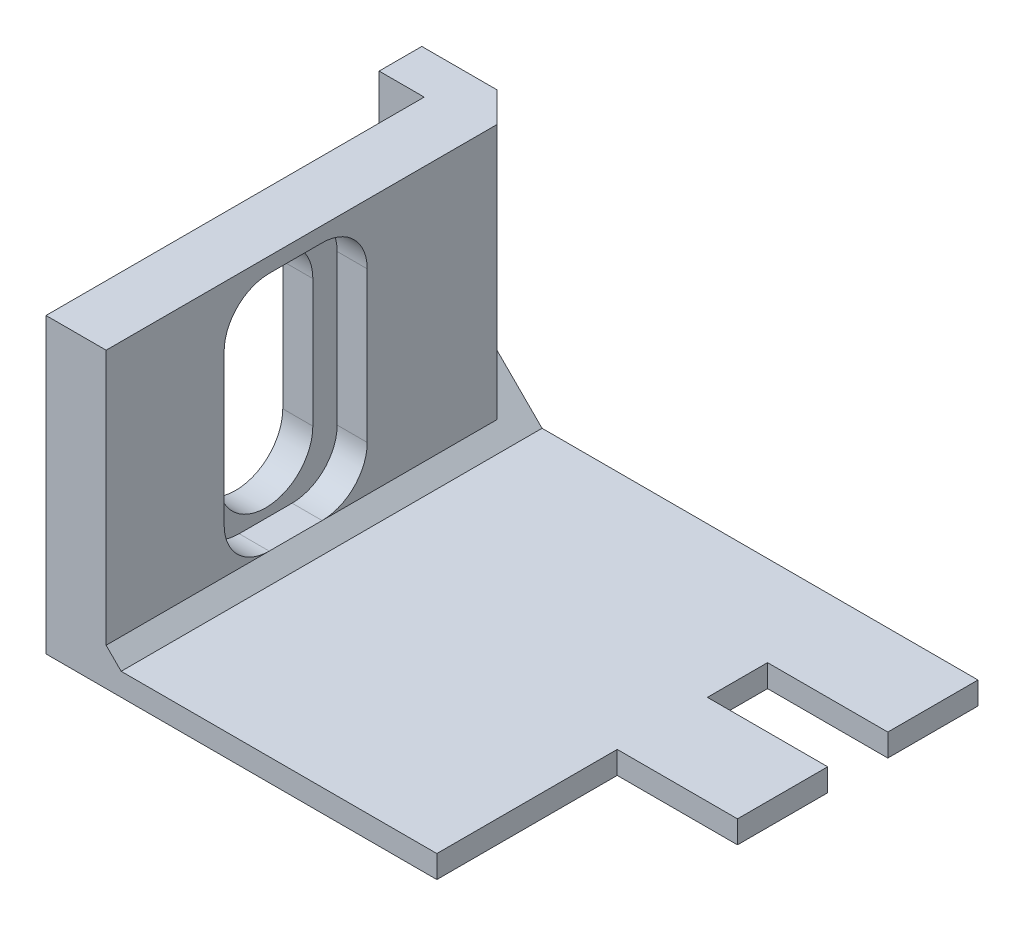
ISO-10303-21;
HEADER;
FILE_DESCRIPTION(('STEP AP214'),'2;1');
FILE_NAME('part.step','',(''),(''),'','','');
FILE_SCHEMA(('AUTOMOTIVE_DESIGN { 1 0 10303 214 1 1 1 1 }'));
ENDSEC;
DATA;
#1=APPLICATION_CONTEXT('core data for automotive mechanical design processes');
#2=APPLICATION_PROTOCOL_DEFINITION('international standard','automotive_design',2000,#1);
#3=PRODUCT_CONTEXT('',#1,'mechanical');
#4=PRODUCT('Part','Part','',(#3));
#5=PRODUCT_RELATED_PRODUCT_CATEGORY('part','',(#4));
#6=PRODUCT_DEFINITION_FORMATION('','',#4);
#7=PRODUCT_DEFINITION_CONTEXT('part definition',#1,'design');
#8=PRODUCT_DEFINITION('design','',#6,#7);
#9=PRODUCT_DEFINITION_SHAPE('','',#8);
#10=(LENGTH_UNIT() NAMED_UNIT(*) SI_UNIT(.MILLI.,.METRE.));
#11=(NAMED_UNIT(*) PLANE_ANGLE_UNIT() SI_UNIT($,.RADIAN.));
#12=(NAMED_UNIT(*) SI_UNIT($,.STERADIAN.) SOLID_ANGLE_UNIT());
#13=UNCERTAINTY_MEASURE_WITH_UNIT(LENGTH_MEASURE(1.E-05),#10,'distance_accuracy_value','');
#14=(GEOMETRIC_REPRESENTATION_CONTEXT(3) GLOBAL_UNCERTAINTY_ASSIGNED_CONTEXT((#13)) GLOBAL_UNIT_ASSIGNED_CONTEXT((#10,
#11,#12)) REPRESENTATION_CONTEXT('',''));
#15=CARTESIAN_POINT('',(0.,0.,0.));
#16=DIRECTION('',(0.,0.,1.));
#17=DIRECTION('',(1.,0.,0.));
#18=AXIS2_PLACEMENT_3D('',#15,#16,#17);
#19=CARTESIAN_POINT('',(0.,1.5,0.));
#20=DIRECTION('',(0.,-1.,0.));
#21=DIRECTION('',(0.,0.,-1.));
#22=AXIS2_PLACEMENT_3D('',#19,#20,#21);
#23=PLANE('',#22);
#24=DIRECTION('',(-1.,0.,0.));
#25=VECTOR('',#24,1.);
#26=CARTESIAN_POINT('',(0.,1.5,0.));
#27=LINE('',#26,#25);
#28=CARTESIAN_POINT('',(37.,1.5,0.));
#29=VERTEX_POINT('',#28);
#30=CARTESIAN_POINT('',(7.99999999999999,1.5,0.));
#31=VERTEX_POINT('',#30);
#32=EDGE_CURVE('E338',#29,#31,#27,.T.);
#33=ORIENTED_EDGE('',*,*,#32,.T.);
#34=DIRECTION('',(0.,0.,1.));
#35=VECTOR('',#34,1.);
#36=CARTESIAN_POINT('',(8.,1.5,28.));
#37=LINE('',#36,#35);
#38=CARTESIAN_POINT('',(8.,1.5,28.));
#39=VERTEX_POINT('',#38);
#40=EDGE_CURVE('E431',#31,#39,#37,.T.);
#41=ORIENTED_EDGE('',*,*,#40,.T.);
#42=DIRECTION('',(1.,0.,0.));
#43=VECTOR('',#42,1.);
#44=CARTESIAN_POINT('',(3.,1.5,28.));
#45=LINE('',#44,#43);
#46=CARTESIAN_POINT('',(29.,1.5,28.));
#47=VERTEX_POINT('',#46);
#48=EDGE_CURVE('E341',#39,#47,#45,.T.);
#49=ORIENTED_EDGE('',*,*,#48,.T.);
#50=DIRECTION('',(0.,0.,-1.));
#51=VECTOR('',#50,1.);
#52=CARTESIAN_POINT('',(29.,1.5,16.));
#53=LINE('',#52,#51);
#54=CARTESIAN_POINT('',(29.,1.5,16.));
#55=VERTEX_POINT('',#54);
#56=EDGE_CURVE('E344',#47,#55,#53,.T.);
#57=ORIENTED_EDGE('',*,*,#56,.T.);
#58=DIRECTION('',(1.,0.,0.));
#59=VECTOR('',#58,1.);
#60=CARTESIAN_POINT('',(29.,1.5,16.));
#61=LINE('',#60,#59);
#62=CARTESIAN_POINT('',(37.,1.5,16.));
#63=VERTEX_POINT('',#62);
#64=EDGE_CURVE('E346',#55,#63,#61,.T.);
#65=ORIENTED_EDGE('',*,*,#64,.T.);
#66=DIRECTION('',(0.,0.,-1.));
#67=VECTOR('',#66,1.);
#68=CARTESIAN_POINT('',(37.,1.5,10.));
#69=LINE('',#68,#67);
#70=CARTESIAN_POINT('',(37.,1.5,10.));
#71=VERTEX_POINT('',#70);
#72=EDGE_CURVE('E348',#63,#71,#69,.T.);
#73=ORIENTED_EDGE('',*,*,#72,.T.);
#74=DIRECTION('',(-1.,0.,0.));
#75=VECTOR('',#74,1.);
#76=CARTESIAN_POINT('',(29.,1.5,10.));
#77=LINE('',#76,#75);
#78=CARTESIAN_POINT('',(29.,1.5,10.));
#79=VERTEX_POINT('',#78);
#80=EDGE_CURVE('E350',#71,#79,#77,.T.);
#81=ORIENTED_EDGE('',*,*,#80,.T.);
#82=DIRECTION('',(0.,0.,-1.));
#83=VECTOR('',#82,1.);
#84=CARTESIAN_POINT('',(29.,1.5,6.));
#85=LINE('',#84,#83);
#86=CARTESIAN_POINT('',(29.,1.5,6.));
#87=VERTEX_POINT('',#86);
#88=EDGE_CURVE('E352',#79,#87,#85,.T.);
#89=ORIENTED_EDGE('',*,*,#88,.T.);
#90=DIRECTION('',(1.,0.,0.));
#91=VECTOR('',#90,1.);
#92=CARTESIAN_POINT('',(29.,1.5,6.));
#93=LINE('',#92,#91);
#94=CARTESIAN_POINT('',(37.,1.5,6.));
#95=VERTEX_POINT('',#94);
#96=EDGE_CURVE('E354',#87,#95,#93,.T.);
#97=ORIENTED_EDGE('',*,*,#96,.T.);
#98=DIRECTION('',(0.,0.,-1.));
#99=VECTOR('',#98,1.);
#100=CARTESIAN_POINT('',(37.,1.5,0.));
#101=LINE('',#100,#99);
#102=EDGE_CURVE('E356',#95,#29,#101,.T.);
#103=ORIENTED_EDGE('',*,*,#102,.T.);
#104=EDGE_LOOP('',(#33,#41,#49,#57,#65,#73,#81,#89,#97,#103));
#105=FACE_BOUND('',#104,.T.);
#106=ADVANCED_FACE('F35',(#105),#23,.F.);
#107=CARTESIAN_POINT('',(0.,1.5,0.));
#108=DIRECTION('',(0.,0.,1.));
#109=DIRECTION('',(1.,0.,0.));
#110=AXIS2_PLACEMENT_3D('',#107,#108,#109);
#111=PLANE('',#110);
#112=DIRECTION('',(-1.,0.,0.));
#113=VECTOR('',#112,1.);
#114=CARTESIAN_POINT('',(0.,19.5,0.));
#115=LINE('',#114,#113);
#116=CARTESIAN_POINT('',(5.,19.5,0.));
#117=VERTEX_POINT('',#116);
#118=CARTESIAN_POINT('',(0.,19.5,0.));
#119=VERTEX_POINT('',#118);
#120=EDGE_CURVE('E320',#117,#119,#115,.T.);
#121=ORIENTED_EDGE('',*,*,#120,.F.);
#122=DIRECTION('',(0.,-1.,0.));
#123=VECTOR('',#122,1.);
#124=CARTESIAN_POINT('',(5.,1.5,0.));
#125=LINE('',#124,#123);
#126=CARTESIAN_POINT('',(5.,4.50000000000004,0.));
#127=VERTEX_POINT('',#126);
#128=EDGE_CURVE('E43',#117,#127,#125,.T.);
#129=ORIENTED_EDGE('',*,*,#128,.T.);
#130=DIRECTION('',(-0.707106781186542,0.707106781186553,0.));
#131=VECTOR('',#130,1.);
#132=CARTESIAN_POINT('',(4.00000000000006,5.5,0.));
#133=LINE('',#132,#131);
#134=EDGE_CURVE('E49',#127,#31,#133,.F.);
#135=ORIENTED_EDGE('',*,*,#134,.T.);
#136=ORIENTED_EDGE('',*,*,#32,.F.);
#137=DIRECTION('',(0.,-1.,0.));
#138=VECTOR('',#137,1.);
#139=CARTESIAN_POINT('',(37.,1.5,0.));
#140=LINE('',#139,#138);
#141=CARTESIAN_POINT('',(37.,0.,0.));
#142=VERTEX_POINT('',#141);
#143=EDGE_CURVE('E358',#29,#142,#140,.T.);
#144=ORIENTED_EDGE('',*,*,#143,.T.);
#145=DIRECTION('',(-1.,0.,0.));
#146=VECTOR('',#145,1.);
#147=CARTESIAN_POINT('',(0.,0.,0.));
#148=LINE('',#147,#146);
#149=CARTESIAN_POINT('',(0.,0.,0.));
#150=VERTEX_POINT('',#149);
#151=EDGE_CURVE('E337',#142,#150,#148,.T.);
#152=ORIENTED_EDGE('',*,*,#151,.T.);
#153=DIRECTION('',(0.,-1.,0.));
#154=VECTOR('',#153,1.);
#155=CARTESIAN_POINT('',(0.,1.5,0.));
#156=LINE('',#155,#154);
#157=EDGE_CURVE('E414',#119,#150,#156,.T.);
#158=ORIENTED_EDGE('',*,*,#157,.F.);
#159=EDGE_LOOP('',(#121,#129,#135,#136,#144,#152,#158));
#160=FACE_BOUND('',#159,.T.);
#161=ADVANCED_FACE('F442',(#160),#111,.F.);
#162=CARTESIAN_POINT('',(0.,1.5,2.84));
#163=DIRECTION('',(1.,0.,0.));
#164=DIRECTION('',(0.,0.,-1.));
#165=AXIS2_PLACEMENT_3D('',#162,#163,#164);
#166=PLANE('',#165);
#167=ORIENTED_EDGE('',*,*,#157,.T.);
#168=DIRECTION('',(0.,0.,1.));
#169=VECTOR('',#168,1.);
#170=CARTESIAN_POINT('',(0.,0.,2.84));
#171=LINE('',#170,#169);
#172=CARTESIAN_POINT('',(0.,0.,2.84));
#173=VERTEX_POINT('',#172);
#174=EDGE_CURVE('E361',#150,#173,#171,.T.);
#175=ORIENTED_EDGE('',*,*,#174,.T.);
#176=DIRECTION('',(0.,-1.,0.));
#177=VECTOR('',#176,1.);
#178=CARTESIAN_POINT('',(0.,1.5,2.84));
#179=LINE('',#178,#177);
#180=CARTESIAN_POINT('',(0.,19.5,2.84));
#181=VERTEX_POINT('',#180);
#182=EDGE_CURVE('E412',#181,#173,#179,.T.);
#183=ORIENTED_EDGE('',*,*,#182,.F.);
#184=DIRECTION('',(0.,0.,1.));
#185=VECTOR('',#184,1.);
#186=CARTESIAN_POINT('',(0.,19.5,0.));
#187=LINE('',#186,#185);
#188=EDGE_CURVE('E322',#119,#181,#187,.T.);
#189=ORIENTED_EDGE('',*,*,#188,.F.);
#190=EDGE_LOOP('',(#167,#175,#183,#189));
#191=FACE_BOUND('',#190,.T.);
#192=ADVANCED_FACE('F501',(#191),#166,.F.);
#193=CARTESIAN_POINT('',(0.,1.5,2.84));
#194=DIRECTION('',(0.,0.,-1.));
#195=DIRECTION('',(-1.,0.,0.));
#196=AXIS2_PLACEMENT_3D('',#193,#194,#195);
#197=PLANE('',#196);
#198=ORIENTED_EDGE('',*,*,#182,.T.);
#199=DIRECTION('',(1.,0.,0.));
#200=VECTOR('',#199,1.);
#201=CARTESIAN_POINT('',(0.,0.,2.84));
#202=LINE('',#201,#200);
#203=CARTESIAN_POINT('',(3.,0.,2.84));
#204=VERTEX_POINT('',#203);
#205=EDGE_CURVE('E364',#173,#204,#202,.T.);
#206=ORIENTED_EDGE('',*,*,#205,.T.);
#207=DIRECTION('',(0.,-1.,0.));
#208=VECTOR('',#207,1.);
#209=CARTESIAN_POINT('',(3.,1.5,2.84));
#210=LINE('',#209,#208);
#211=CARTESIAN_POINT('',(3.,19.5,2.84));
#212=VERTEX_POINT('',#211);
#213=EDGE_CURVE('E410',#212,#204,#210,.T.);
#214=ORIENTED_EDGE('',*,*,#213,.F.);
#215=DIRECTION('',(1.,0.,0.));
#216=VECTOR('',#215,1.);
#217=CARTESIAN_POINT('',(0.,19.5,2.84));
#218=LINE('',#217,#216);
#219=EDGE_CURVE('E325',#181,#212,#218,.T.);
#220=ORIENTED_EDGE('',*,*,#219,.F.);
#221=EDGE_LOOP('',(#198,#206,#214,#220));
#222=FACE_BOUND('',#221,.T.);
#223=ADVANCED_FACE('F545',(#222),#197,.F.);
#224=CARTESIAN_POINT('',(3.,1.5,28.));
#225=DIRECTION('',(1.,0.,0.));
#226=DIRECTION('',(0.,0.,-1.));
#227=AXIS2_PLACEMENT_3D('',#224,#225,#226);
#228=PLANE('',#227);
#229=DIRECTION('',(0.,1.,0.));
#230=VECTOR('',#229,1.);
#231=CARTESIAN_POINT('',(3.,1.50000000000001,12.25));
#232=LINE('',#231,#230);
#233=CARTESIAN_POINT('',(3.,6.25,12.25));
#234=VERTEX_POINT('',#233);
#235=CARTESIAN_POINT('',(3.,14.75,12.25));
#236=VERTEX_POINT('',#235);
#237=EDGE_CURVE('E420',#234,#236,#232,.T.);
#238=ORIENTED_EDGE('',*,*,#237,.T.);
#239=CARTESIAN_POINT('',(3.,14.75,15.39));
#240=DIRECTION('',(1.,0.,0.));
#241=DIRECTION('',(0.,0.,-1.));
#242=AXIS2_PLACEMENT_3D('',#239,#240,#241);
#243=CIRCLE('',#242,3.14);
#244=CARTESIAN_POINT('',(3.,14.75,18.53));
#245=VERTEX_POINT('',#244);
#246=EDGE_CURVE('E423',#236,#245,#243,.T.);
#247=ORIENTED_EDGE('',*,*,#246,.T.);
#248=DIRECTION('',(0.,-1.,0.));
#249=VECTOR('',#248,1.);
#250=CARTESIAN_POINT('',(3.,1.5,18.53));
#251=LINE('',#250,#249);
#252=CARTESIAN_POINT('',(3.,6.25,18.53));
#253=VERTEX_POINT('',#252);
#254=EDGE_CURVE('E226',#245,#253,#251,.T.);
#255=ORIENTED_EDGE('',*,*,#254,.T.);
#256=CARTESIAN_POINT('',(3.,6.25,15.39));
#257=DIRECTION('',(1.,0.,0.));
#258=DIRECTION('',(0.,0.,-1.));
#259=AXIS2_PLACEMENT_3D('',#256,#257,#258);
#260=CIRCLE('',#259,3.14);
#261=EDGE_CURVE('E417',#253,#234,#260,.T.);
#262=ORIENTED_EDGE('',*,*,#261,.T.);
#263=EDGE_LOOP('',(#238,#247,#255,#262));
#264=FACE_BOUND('',#263,.T.);
#265=ORIENTED_EDGE('',*,*,#213,.T.);
#266=DIRECTION('',(0.,0.,1.));
#267=VECTOR('',#266,1.);
#268=CARTESIAN_POINT('',(3.,0.,28.));
#269=LINE('',#268,#267);
#270=CARTESIAN_POINT('',(3.,0.,28.));
#271=VERTEX_POINT('',#270);
#272=EDGE_CURVE('E367',#204,#271,#269,.T.);
#273=ORIENTED_EDGE('',*,*,#272,.T.);
#274=DIRECTION('',(0.,-1.,0.));
#275=VECTOR('',#274,1.);
#276=CARTESIAN_POINT('',(3.,1.5,28.));
#277=LINE('',#276,#275);
#278=CARTESIAN_POINT('',(3.,19.5,28.));
#279=VERTEX_POINT('',#278);
#280=EDGE_CURVE('E408',#279,#271,#277,.T.);
#281=ORIENTED_EDGE('',*,*,#280,.F.);
#282=DIRECTION('',(0.,0.,1.));
#283=VECTOR('',#282,1.);
#284=CARTESIAN_POINT('',(3.,19.5,0.));
#285=LINE('',#284,#283);
#286=EDGE_CURVE('E328',#212,#279,#285,.T.);
#287=ORIENTED_EDGE('',*,*,#286,.F.);
#288=EDGE_LOOP('',(#265,#273,#281,#287));
#289=FACE_BOUND('',#288,.T.);
#290=ADVANCED_FACE('F541',(#264,#289),#228,.F.);
#291=CARTESIAN_POINT('',(3.,1.5,28.));
#292=DIRECTION('',(0.,0.,-1.));
#293=DIRECTION('',(-1.,0.,0.));
#294=AXIS2_PLACEMENT_3D('',#291,#292,#293);
#295=PLANE('',#294);
#296=ORIENTED_EDGE('',*,*,#48,.F.);
#297=DIRECTION('',(0.707106781186542,-0.707106781186553,0.));
#298=VECTOR('',#297,1.);
#299=CARTESIAN_POINT('',(5.50000000000004,4.,28.));
#300=LINE('',#299,#298);
#301=CARTESIAN_POINT('',(7.,2.50000000000001,28.));
#302=VERTEX_POINT('',#301);
#303=EDGE_CURVE('E434',#39,#302,#300,.F.);
#304=ORIENTED_EDGE('',*,*,#303,.T.);
#305=DIRECTION('',(0.,1.,0.));
#306=VECTOR('',#305,1.);
#307=CARTESIAN_POINT('',(7.,0.5,28.));
#308=LINE('',#307,#306);
#309=CARTESIAN_POINT('',(7.,19.5,28.));
#310=VERTEX_POINT('',#309);
#311=EDGE_CURVE('E334',#302,#310,#308,.T.);
#312=ORIENTED_EDGE('',*,*,#311,.T.);
#313=DIRECTION('',(1.,0.,0.));
#314=VECTOR('',#313,1.);
#315=CARTESIAN_POINT('',(0.,19.5,28.));
#316=LINE('',#315,#314);
#317=EDGE_CURVE('E331',#279,#310,#316,.T.);
#318=ORIENTED_EDGE('',*,*,#317,.F.);
#319=ORIENTED_EDGE('',*,*,#280,.T.);
#320=DIRECTION('',(1.,0.,0.));
#321=VECTOR('',#320,1.);
#322=CARTESIAN_POINT('',(3.,0.,28.));
#323=LINE('',#322,#321);
#324=CARTESIAN_POINT('',(29.,0.,28.));
#325=VERTEX_POINT('',#324);
#326=EDGE_CURVE('E370',#271,#325,#323,.T.);
#327=ORIENTED_EDGE('',*,*,#326,.T.);
#328=DIRECTION('',(0.,-1.,0.));
#329=VECTOR('',#328,1.);
#330=CARTESIAN_POINT('',(29.,1.5,28.));
#331=LINE('',#330,#329);
#332=EDGE_CURVE('E405',#47,#325,#331,.T.);
#333=ORIENTED_EDGE('',*,*,#332,.F.);
#334=EDGE_LOOP('',(#296,#304,#312,#318,#319,#327,#333));
#335=FACE_BOUND('',#334,.T.);
#336=ADVANCED_FACE('F537',(#335),#295,.F.);
#337=CARTESIAN_POINT('',(29.,1.5,16.));
#338=DIRECTION('',(-1.,0.,0.));
#339=DIRECTION('',(0.,0.,1.));
#340=AXIS2_PLACEMENT_3D('',#337,#338,#339);
#341=PLANE('',#340);
#342=DIRECTION('',(0.,0.,-1.));
#343=VECTOR('',#342,1.);
#344=CARTESIAN_POINT('',(29.,0.,16.));
#345=LINE('',#344,#343);
#346=CARTESIAN_POINT('',(29.,0.,16.));
#347=VERTEX_POINT('',#346);
#348=EDGE_CURVE('E372',#325,#347,#345,.T.);
#349=ORIENTED_EDGE('',*,*,#348,.T.);
#350=DIRECTION('',(0.,-1.,0.));
#351=VECTOR('',#350,1.);
#352=CARTESIAN_POINT('',(29.,1.5,16.));
#353=LINE('',#352,#351);
#354=EDGE_CURVE('E402',#55,#347,#353,.T.);
#355=ORIENTED_EDGE('',*,*,#354,.F.);
#356=ORIENTED_EDGE('',*,*,#56,.F.);
#357=ORIENTED_EDGE('',*,*,#332,.T.);
#358=EDGE_LOOP('',(#349,#355,#356,#357));
#359=FACE_BOUND('',#358,.T.);
#360=ADVANCED_FACE('F533',(#359),#341,.F.);
#361=CARTESIAN_POINT('',(29.,1.5,16.));
#362=DIRECTION('',(0.,0.,-1.));
#363=DIRECTION('',(-1.,0.,0.));
#364=AXIS2_PLACEMENT_3D('',#361,#362,#363);
#365=PLANE('',#364);
#366=DIRECTION('',(1.,0.,0.));
#367=VECTOR('',#366,1.);
#368=CARTESIAN_POINT('',(29.,0.,16.));
#369=LINE('',#368,#367);
#370=CARTESIAN_POINT('',(37.,0.,16.));
#371=VERTEX_POINT('',#370);
#372=EDGE_CURVE('E374',#347,#371,#369,.T.);
#373=ORIENTED_EDGE('',*,*,#372,.T.);
#374=DIRECTION('',(0.,-1.,0.));
#375=VECTOR('',#374,1.);
#376=CARTESIAN_POINT('',(37.,1.5,16.));
#377=LINE('',#376,#375);
#378=EDGE_CURVE('E399',#63,#371,#377,.T.);
#379=ORIENTED_EDGE('',*,*,#378,.F.);
#380=ORIENTED_EDGE('',*,*,#64,.F.);
#381=ORIENTED_EDGE('',*,*,#354,.T.);
#382=EDGE_LOOP('',(#373,#379,#380,#381));
#383=FACE_BOUND('',#382,.T.);
#384=ADVANCED_FACE('F529',(#383),#365,.F.);
#385=CARTESIAN_POINT('',(37.,1.5,10.));
#386=DIRECTION('',(-1.,0.,0.));
#387=DIRECTION('',(0.,0.,1.));
#388=AXIS2_PLACEMENT_3D('',#385,#386,#387);
#389=PLANE('',#388);
#390=DIRECTION('',(0.,0.,-1.));
#391=VECTOR('',#390,1.);
#392=CARTESIAN_POINT('',(37.,0.,10.));
#393=LINE('',#392,#391);
#394=CARTESIAN_POINT('',(37.,0.,10.));
#395=VERTEX_POINT('',#394);
#396=EDGE_CURVE('E376',#371,#395,#393,.T.);
#397=ORIENTED_EDGE('',*,*,#396,.T.);
#398=DIRECTION('',(0.,-1.,0.));
#399=VECTOR('',#398,1.);
#400=CARTESIAN_POINT('',(37.,1.5,10.));
#401=LINE('',#400,#399);
#402=EDGE_CURVE('E396',#71,#395,#401,.T.);
#403=ORIENTED_EDGE('',*,*,#402,.F.);
#404=ORIENTED_EDGE('',*,*,#72,.F.);
#405=ORIENTED_EDGE('',*,*,#378,.T.);
#406=EDGE_LOOP('',(#397,#403,#404,#405));
#407=FACE_BOUND('',#406,.T.);
#408=ADVANCED_FACE('F525',(#407),#389,.F.);
#409=CARTESIAN_POINT('',(29.,1.5,10.));
#410=DIRECTION('',(0.,0.,1.));
#411=DIRECTION('',(1.,0.,0.));
#412=AXIS2_PLACEMENT_3D('',#409,#410,#411);
#413=PLANE('',#412);
#414=DIRECTION('',(-1.,0.,0.));
#415=VECTOR('',#414,1.);
#416=CARTESIAN_POINT('',(29.,0.,10.));
#417=LINE('',#416,#415);
#418=CARTESIAN_POINT('',(29.,0.,10.));
#419=VERTEX_POINT('',#418);
#420=EDGE_CURVE('E378',#395,#419,#417,.T.);
#421=ORIENTED_EDGE('',*,*,#420,.T.);
#422=DIRECTION('',(0.,-1.,0.));
#423=VECTOR('',#422,1.);
#424=CARTESIAN_POINT('',(29.,1.5,10.));
#425=LINE('',#424,#423);
#426=EDGE_CURVE('E393',#79,#419,#425,.T.);
#427=ORIENTED_EDGE('',*,*,#426,.F.);
#428=ORIENTED_EDGE('',*,*,#80,.F.);
#429=ORIENTED_EDGE('',*,*,#402,.T.);
#430=EDGE_LOOP('',(#421,#427,#428,#429));
#431=FACE_BOUND('',#430,.T.);
#432=ADVANCED_FACE('F521',(#431),#413,.F.);
#433=CARTESIAN_POINT('',(29.,1.5,6.));
#434=DIRECTION('',(-1.,0.,0.));
#435=DIRECTION('',(0.,0.,1.));
#436=AXIS2_PLACEMENT_3D('',#433,#434,#435);
#437=PLANE('',#436);
#438=DIRECTION('',(0.,0.,-1.));
#439=VECTOR('',#438,1.);
#440=CARTESIAN_POINT('',(29.,0.,6.));
#441=LINE('',#440,#439);
#442=CARTESIAN_POINT('',(29.,0.,6.));
#443=VERTEX_POINT('',#442);
#444=EDGE_CURVE('E380',#419,#443,#441,.T.);
#445=ORIENTED_EDGE('',*,*,#444,.T.);
#446=DIRECTION('',(0.,-1.,0.));
#447=VECTOR('',#446,1.);
#448=CARTESIAN_POINT('',(29.,1.5,6.));
#449=LINE('',#448,#447);
#450=EDGE_CURVE('E390',#87,#443,#449,.T.);
#451=ORIENTED_EDGE('',*,*,#450,.F.);
#452=ORIENTED_EDGE('',*,*,#88,.F.);
#453=ORIENTED_EDGE('',*,*,#426,.T.);
#454=EDGE_LOOP('',(#445,#451,#452,#453));
#455=FACE_BOUND('',#454,.T.);
#456=ADVANCED_FACE('F517',(#455),#437,.F.);
#457=CARTESIAN_POINT('',(29.,1.5,6.));
#458=DIRECTION('',(0.,0.,-1.));
#459=DIRECTION('',(-1.,0.,0.));
#460=AXIS2_PLACEMENT_3D('',#457,#458,#459);
#461=PLANE('',#460);
#462=DIRECTION('',(1.,0.,0.));
#463=VECTOR('',#462,1.);
#464=CARTESIAN_POINT('',(29.,0.,6.));
#465=LINE('',#464,#463);
#466=CARTESIAN_POINT('',(37.,0.,6.));
#467=VERTEX_POINT('',#466);
#468=EDGE_CURVE('E382',#443,#467,#465,.T.);
#469=ORIENTED_EDGE('',*,*,#468,.T.);
#470=DIRECTION('',(0.,-1.,0.));
#471=VECTOR('',#470,1.);
#472=CARTESIAN_POINT('',(37.,1.5,6.));
#473=LINE('',#472,#471);
#474=EDGE_CURVE('E387',#95,#467,#473,.T.);
#475=ORIENTED_EDGE('',*,*,#474,.F.);
#476=ORIENTED_EDGE('',*,*,#96,.F.);
#477=ORIENTED_EDGE('',*,*,#450,.T.);
#478=EDGE_LOOP('',(#469,#475,#476,#477));
#479=FACE_BOUND('',#478,.T.);
#480=ADVANCED_FACE('F513',(#479),#461,.F.);
#481=CARTESIAN_POINT('',(37.,1.5,0.));
#482=DIRECTION('',(-1.,0.,0.));
#483=DIRECTION('',(0.,0.,1.));
#484=AXIS2_PLACEMENT_3D('',#481,#482,#483);
#485=PLANE('',#484);
#486=DIRECTION('',(0.,0.,-1.));
#487=VECTOR('',#486,1.);
#488=CARTESIAN_POINT('',(37.,0.,0.));
#489=LINE('',#488,#487);
#490=EDGE_CURVE('E342',#467,#142,#489,.T.);
#491=ORIENTED_EDGE('',*,*,#490,.T.);
#492=ORIENTED_EDGE('',*,*,#143,.F.);
#493=ORIENTED_EDGE('',*,*,#102,.F.);
#494=ORIENTED_EDGE('',*,*,#474,.T.);
#495=EDGE_LOOP('',(#491,#492,#493,#494));
#496=FACE_BOUND('',#495,.T.);
#497=ADVANCED_FACE('F509',(#496),#485,.F.);
#498=CARTESIAN_POINT('',(0.,0.,0.));
#499=DIRECTION('',(0.,-1.,0.));
#500=DIRECTION('',(0.,0.,-1.));
#501=AXIS2_PLACEMENT_3D('',#498,#499,#500);
#502=PLANE('',#501);
#503=ORIENTED_EDGE('',*,*,#151,.F.);
#504=ORIENTED_EDGE('',*,*,#490,.F.);
#505=ORIENTED_EDGE('',*,*,#468,.F.);
#506=ORIENTED_EDGE('',*,*,#444,.F.);
#507=ORIENTED_EDGE('',*,*,#420,.F.);
#508=ORIENTED_EDGE('',*,*,#396,.F.);
#509=ORIENTED_EDGE('',*,*,#372,.F.);
#510=ORIENTED_EDGE('',*,*,#348,.F.);
#511=ORIENTED_EDGE('',*,*,#326,.F.);
#512=ORIENTED_EDGE('',*,*,#272,.F.);
#513=ORIENTED_EDGE('',*,*,#205,.F.);
#514=ORIENTED_EDGE('',*,*,#174,.F.);
#515=EDGE_LOOP('',(#503,#504,#505,#506,#507,#508,#509,#510,#511,#512,#513,#514));
#516=FACE_BOUND('',#515,.T.);
#517=ADVANCED_FACE('F506',(#516),#502,.T.);
#518=CARTESIAN_POINT('',(7.,0.5,0.));
#519=DIRECTION('',(-1.,0.,0.));
#520=DIRECTION('',(0.,0.,1.));
#521=AXIS2_PLACEMENT_3D('',#518,#519,#520);
#522=PLANE('',#521);
#523=DIRECTION('',(0.,0.,-1.));
#524=VECTOR('',#523,1.);
#525=CARTESIAN_POINT('',(7.,2.50000000000001,0.));
#526=LINE('',#525,#524);
#527=CARTESIAN_POINT('',(7.,2.5,13.63));
#528=VERTEX_POINT('',#527);
#529=CARTESIAN_POINT('',(7.,2.50000000000001,2.));
#530=VERTEX_POINT('',#529);
#531=EDGE_CURVE('E425',#528,#530,#526,.T.);
#532=ORIENTED_EDGE('',*,*,#531,.T.);
#533=DIRECTION('',(0.,1.,0.));
#534=VECTOR('',#533,1.);
#535=CARTESIAN_POINT('',(7.,0.5,2.));
#536=LINE('',#535,#534);
#537=CARTESIAN_POINT('',(7.,19.5,2.));
#538=VERTEX_POINT('',#537);
#539=EDGE_CURVE('E436',#530,#538,#536,.T.);
#540=ORIENTED_EDGE('',*,*,#539,.T.);
#541=DIRECTION('',(0.,0.,1.));
#542=VECTOR('',#541,1.);
#543=CARTESIAN_POINT('',(7.,19.5,0.));
#544=LINE('',#543,#542);
#545=EDGE_CURVE('E304',#538,#310,#544,.T.);
#546=ORIENTED_EDGE('',*,*,#545,.T.);
#547=ORIENTED_EDGE('',*,*,#311,.F.);
#548=DIRECTION('',(0.,0.,-1.));
#549=VECTOR('',#548,1.);
#550=CARTESIAN_POINT('',(7.,2.50000000000001,0.));
#551=LINE('',#550,#549);
#552=CARTESIAN_POINT('',(7.,2.5,17.15));
#553=VERTEX_POINT('',#552);
#554=EDGE_CURVE('E428',#302,#553,#551,.T.);
#555=ORIENTED_EDGE('',*,*,#554,.T.);
#556=CARTESIAN_POINT('',(7.,5.5,17.15));
#557=DIRECTION('',(1.,0.,0.));
#558=DIRECTION('',(0.,0.,-1.));
#559=AXIS2_PLACEMENT_3D('',#556,#557,#558);
#560=CIRCLE('',#559,3.);
#561=CARTESIAN_POINT('',(7.,5.5,20.15));
#562=VERTEX_POINT('',#561);
#563=EDGE_CURVE('E249',#562,#553,#560,.T.);
#564=ORIENTED_EDGE('',*,*,#563,.F.);
#565=DIRECTION('',(0.,-1.,0.));
#566=VECTOR('',#565,1.);
#567=CARTESIAN_POINT('',(7.,5.5,20.15));
#568=LINE('',#567,#566);
#569=CARTESIAN_POINT('',(7.,15.5,20.15));
#570=VERTEX_POINT('',#569);
#571=EDGE_CURVE('E258',#570,#562,#568,.T.);
#572=ORIENTED_EDGE('',*,*,#571,.F.);
#573=CARTESIAN_POINT('',(7.,15.5,17.15));
#574=DIRECTION('',(1.,0.,0.));
#575=DIRECTION('',(0.,0.,1.));
#576=AXIS2_PLACEMENT_3D('',#573,#574,#575);
#577=CIRCLE('',#576,3.);
#578=CARTESIAN_POINT('',(7.,18.5,17.15));
#579=VERTEX_POINT('',#578);
#580=EDGE_CURVE('E297',#579,#570,#577,.T.);
#581=ORIENTED_EDGE('',*,*,#580,.F.);
#582=DIRECTION('',(0.,0.,1.));
#583=VECTOR('',#582,1.);
#584=CARTESIAN_POINT('',(7.,18.5,17.15));
#585=LINE('',#584,#583);
#586=CARTESIAN_POINT('',(7.,18.5,13.63));
#587=VERTEX_POINT('',#586);
#588=EDGE_CURVE('E294',#587,#579,#585,.T.);
#589=ORIENTED_EDGE('',*,*,#588,.F.);
#590=CARTESIAN_POINT('',(7.,15.5,13.63));
#591=DIRECTION('',(1.,0.,0.));
#592=DIRECTION('',(0.,0.,1.));
#593=AXIS2_PLACEMENT_3D('',#590,#591,#592);
#594=CIRCLE('',#593,3.);
#595=CARTESIAN_POINT('',(7.,15.5,10.63));
#596=VERTEX_POINT('',#595);
#597=EDGE_CURVE('E291',#596,#587,#594,.T.);
#598=ORIENTED_EDGE('',*,*,#597,.F.);
#599=DIRECTION('',(0.,1.,0.));
#600=VECTOR('',#599,1.);
#601=CARTESIAN_POINT('',(7.,5.5,10.63));
#602=LINE('',#601,#600);
#603=CARTESIAN_POINT('',(7.,5.5,10.63));
#604=VERTEX_POINT('',#603);
#605=EDGE_CURVE('E288',#604,#596,#602,.T.);
#606=ORIENTED_EDGE('',*,*,#605,.F.);
#607=CARTESIAN_POINT('',(7.,5.5,13.63));
#608=DIRECTION('',(1.,0.,0.));
#609=DIRECTION('',(0.,0.,-1.));
#610=AXIS2_PLACEMENT_3D('',#607,#608,#609);
#611=CIRCLE('',#610,3.);
#612=EDGE_CURVE('E285',#528,#604,#611,.T.);
#613=ORIENTED_EDGE('',*,*,#612,.F.);
#614=EDGE_LOOP('',(#532,#540,#546,#547,#555,#564,#572,#581,#589,#598,#606,#613));
#615=FACE_BOUND('',#614,.T.);
#616=ADVANCED_FACE('F452',(#615),#522,.F.);
#617=CARTESIAN_POINT('',(0.,19.5,0.));
#618=DIRECTION('',(0.,1.,0.));
#619=DIRECTION('',(0.,0.,1.));
#620=AXIS2_PLACEMENT_3D('',#617,#618,#619);
#621=PLANE('',#620);
#622=ORIENTED_EDGE('',*,*,#545,.F.);
#623=DIRECTION('',(0.707106781186549,0.,0.707106781186546));
#624=VECTOR('',#623,1.);
#625=CARTESIAN_POINT('',(2.49999999999999,19.5,-2.5));
#626=LINE('',#625,#624);
#627=EDGE_CURVE('E57',#538,#117,#626,.F.);
#628=ORIENTED_EDGE('',*,*,#627,.T.);
#629=ORIENTED_EDGE('',*,*,#120,.T.);
#630=ORIENTED_EDGE('',*,*,#188,.T.);
#631=ORIENTED_EDGE('',*,*,#219,.T.);
#632=ORIENTED_EDGE('',*,*,#286,.T.);
#633=ORIENTED_EDGE('',*,*,#317,.T.);
#634=EDGE_LOOP('',(#622,#628,#629,#630,#631,#632,#633));
#635=FACE_BOUND('',#634,.T.);
#636=ADVANCED_FACE('F588',(#635),#621,.T.);
#637=CARTESIAN_POINT('',(5.,5.5,17.15));
#638=DIRECTION('',(1.,0.,0.));
#639=DIRECTION('',(0.,0.,-1.));
#640=AXIS2_PLACEMENT_3D('',#637,#638,#639);
#641=CYLINDRICAL_SURFACE('',#640,3.);
#642=ORIENTED_EDGE('',*,*,#563,.T.);
#643=DIRECTION('',(1.,0.,0.));
#644=VECTOR('',#643,1.);
#645=CARTESIAN_POINT('',(5.,2.5,17.15));
#646=LINE('',#645,#644);
#647=CARTESIAN_POINT('',(5.,2.5,17.15));
#648=VERTEX_POINT('',#647);
#649=EDGE_CURVE('E279',#648,#553,#646,.T.);
#650=ORIENTED_EDGE('',*,*,#649,.F.);
#651=CARTESIAN_POINT('',(5.,5.5,17.15));
#652=DIRECTION('',(1.,0.,0.));
#653=DIRECTION('',(0.,0.,-1.));
#654=AXIS2_PLACEMENT_3D('',#651,#652,#653);
#655=CIRCLE('',#654,3.);
#656=CARTESIAN_POINT('',(5.,5.5,20.15));
#657=VERTEX_POINT('',#656);
#658=EDGE_CURVE('E254',#657,#648,#655,.T.);
#659=ORIENTED_EDGE('',*,*,#658,.F.);
#660=DIRECTION('',(1.,0.,0.));
#661=VECTOR('',#660,1.);
#662=CARTESIAN_POINT('',(5.,5.5,20.15));
#663=LINE('',#662,#661);
#664=EDGE_CURVE('E302',#657,#562,#663,.T.);
#665=ORIENTED_EDGE('',*,*,#664,.T.);
#666=EDGE_LOOP('',(#642,#650,#659,#665));
#667=FACE_BOUND('',#666,.T.);
#668=ADVANCED_FACE('F467',(#667),#641,.F.);
#669=CARTESIAN_POINT('',(5.,5.5,20.15));
#670=DIRECTION('',(0.,0.,1.));
#671=DIRECTION('',(1.,0.,0.));
#672=AXIS2_PLACEMENT_3D('',#669,#670,#671);
#673=PLANE('',#672);
#674=ORIENTED_EDGE('',*,*,#571,.T.);
#675=ORIENTED_EDGE('',*,*,#664,.F.);
#676=DIRECTION('',(0.,-1.,0.));
#677=VECTOR('',#676,1.);
#678=CARTESIAN_POINT('',(5.,5.5,20.15));
#679=LINE('',#678,#677);
#680=CARTESIAN_POINT('',(5.,15.5,20.15));
#681=VERTEX_POINT('',#680);
#682=EDGE_CURVE('E276',#681,#657,#679,.T.);
#683=ORIENTED_EDGE('',*,*,#682,.F.);
#684=DIRECTION('',(1.,0.,0.));
#685=VECTOR('',#684,1.);
#686=CARTESIAN_POINT('',(5.,15.5,20.15));
#687=LINE('',#686,#685);
#688=EDGE_CURVE('E305',#681,#570,#687,.T.);
#689=ORIENTED_EDGE('',*,*,#688,.T.);
#690=EDGE_LOOP('',(#674,#675,#683,#689));
#691=FACE_BOUND('',#690,.T.);
#692=ADVANCED_FACE('F471',(#691),#673,.F.);
#693=CARTESIAN_POINT('',(5.,15.5,17.15));
#694=DIRECTION('',(1.,0.,0.));
#695=DIRECTION('',(0.,0.,-1.));
#696=AXIS2_PLACEMENT_3D('',#693,#694,#695);
#697=CYLINDRICAL_SURFACE('',#696,3.);
#698=ORIENTED_EDGE('',*,*,#580,.T.);
#699=ORIENTED_EDGE('',*,*,#688,.F.);
#700=CARTESIAN_POINT('',(5.,15.5,17.15));
#701=DIRECTION('',(1.,0.,0.));
#702=DIRECTION('',(0.,0.,1.));
#703=AXIS2_PLACEMENT_3D('',#700,#701,#702);
#704=CIRCLE('',#703,3.);
#705=CARTESIAN_POINT('',(5.,18.5,17.15));
#706=VERTEX_POINT('',#705);
#707=EDGE_CURVE('E273',#706,#681,#704,.T.);
#708=ORIENTED_EDGE('',*,*,#707,.F.);
#709=DIRECTION('',(1.,0.,0.));
#710=VECTOR('',#709,1.);
#711=CARTESIAN_POINT('',(5.,18.5,17.15));
#712=LINE('',#711,#710);
#713=EDGE_CURVE('E307',#706,#579,#712,.T.);
#714=ORIENTED_EDGE('',*,*,#713,.T.);
#715=EDGE_LOOP('',(#698,#699,#708,#714));
#716=FACE_BOUND('',#715,.T.);
#717=ADVANCED_FACE('F475',(#716),#697,.F.);
#718=CARTESIAN_POINT('',(5.,18.5,17.15));
#719=DIRECTION('',(0.,1.,0.));
#720=DIRECTION('',(0.,0.,1.));
#721=AXIS2_PLACEMENT_3D('',#718,#719,#720);
#722=PLANE('',#721);
#723=ORIENTED_EDGE('',*,*,#588,.T.);
#724=ORIENTED_EDGE('',*,*,#713,.F.);
#725=DIRECTION('',(0.,0.,1.));
#726=VECTOR('',#725,1.);
#727=CARTESIAN_POINT('',(5.,18.5,17.15));
#728=LINE('',#727,#726);
#729=CARTESIAN_POINT('',(5.,18.5,13.63));
#730=VERTEX_POINT('',#729);
#731=EDGE_CURVE('E270',#730,#706,#728,.T.);
#732=ORIENTED_EDGE('',*,*,#731,.F.);
#733=DIRECTION('',(1.,0.,0.));
#734=VECTOR('',#733,1.);
#735=CARTESIAN_POINT('',(5.,18.5,13.63));
#736=LINE('',#735,#734);
#737=EDGE_CURVE('E309',#730,#587,#736,.T.);
#738=ORIENTED_EDGE('',*,*,#737,.T.);
#739=EDGE_LOOP('',(#723,#724,#732,#738));
#740=FACE_BOUND('',#739,.T.);
#741=ADVANCED_FACE('F479',(#740),#722,.F.);
#742=CARTESIAN_POINT('',(5.,15.5,13.63));
#743=DIRECTION('',(1.,0.,0.));
#744=DIRECTION('',(0.,0.,-1.));
#745=AXIS2_PLACEMENT_3D('',#742,#743,#744);
#746=CYLINDRICAL_SURFACE('',#745,3.);
#747=ORIENTED_EDGE('',*,*,#597,.T.);
#748=ORIENTED_EDGE('',*,*,#737,.F.);
#749=CARTESIAN_POINT('',(5.,15.5,13.63));
#750=DIRECTION('',(1.,0.,0.));
#751=DIRECTION('',(0.,0.,1.));
#752=AXIS2_PLACEMENT_3D('',#749,#750,#751);
#753=CIRCLE('',#752,3.);
#754=CARTESIAN_POINT('',(5.,15.5,10.63));
#755=VERTEX_POINT('',#754);
#756=EDGE_CURVE('E267',#755,#730,#753,.T.);
#757=ORIENTED_EDGE('',*,*,#756,.F.);
#758=DIRECTION('',(1.,0.,0.));
#759=VECTOR('',#758,1.);
#760=CARTESIAN_POINT('',(5.,15.5,10.63));
#761=LINE('',#760,#759);
#762=EDGE_CURVE('E311',#755,#596,#761,.T.);
#763=ORIENTED_EDGE('',*,*,#762,.T.);
#764=EDGE_LOOP('',(#747,#748,#757,#763));
#765=FACE_BOUND('',#764,.T.);
#766=ADVANCED_FACE('F482',(#765),#746,.F.);
#767=CARTESIAN_POINT('',(5.,5.5,10.63));
#768=DIRECTION('',(0.,0.,-1.));
#769=DIRECTION('',(0.,1.,0.));
#770=AXIS2_PLACEMENT_3D('',#767,#768,#769);
#771=PLANE('',#770);
#772=ORIENTED_EDGE('',*,*,#605,.T.);
#773=ORIENTED_EDGE('',*,*,#762,.F.);
#774=DIRECTION('',(0.,1.,0.));
#775=VECTOR('',#774,1.);
#776=CARTESIAN_POINT('',(5.,5.5,10.63));
#777=LINE('',#776,#775);
#778=CARTESIAN_POINT('',(5.,5.5,10.63));
#779=VERTEX_POINT('',#778);
#780=EDGE_CURVE('E264',#779,#755,#777,.T.);
#781=ORIENTED_EDGE('',*,*,#780,.F.);
#782=DIRECTION('',(1.,0.,0.));
#783=VECTOR('',#782,1.);
#784=CARTESIAN_POINT('',(5.,5.5,10.63));
#785=LINE('',#784,#783);
#786=EDGE_CURVE('E313',#779,#604,#785,.T.);
#787=ORIENTED_EDGE('',*,*,#786,.T.);
#788=EDGE_LOOP('',(#772,#773,#781,#787));
#789=FACE_BOUND('',#788,.T.);
#790=ADVANCED_FACE('F484',(#789),#771,.F.);
#791=CARTESIAN_POINT('',(5.,5.5,13.63));
#792=DIRECTION('',(1.,0.,0.));
#793=DIRECTION('',(0.,0.,-1.));
#794=AXIS2_PLACEMENT_3D('',#791,#792,#793);
#795=CYLINDRICAL_SURFACE('',#794,3.);
#796=ORIENTED_EDGE('',*,*,#612,.T.);
#797=ORIENTED_EDGE('',*,*,#786,.F.);
#798=CARTESIAN_POINT('',(5.,5.5,13.63));
#799=DIRECTION('',(1.,0.,0.));
#800=DIRECTION('',(0.,0.,-1.));
#801=AXIS2_PLACEMENT_3D('',#798,#799,#800);
#802=CIRCLE('',#801,3.);
#803=CARTESIAN_POINT('',(5.,2.5,13.63));
#804=VERTEX_POINT('',#803);
#805=EDGE_CURVE('E261',#804,#779,#802,.T.);
#806=ORIENTED_EDGE('',*,*,#805,.F.);
#807=DIRECTION('',(1.,0.,0.));
#808=VECTOR('',#807,1.);
#809=CARTESIAN_POINT('',(5.,2.5,13.63));
#810=LINE('',#809,#808);
#811=EDGE_CURVE('E315',#804,#528,#810,.T.);
#812=ORIENTED_EDGE('',*,*,#811,.T.);
#813=EDGE_LOOP('',(#796,#797,#806,#812));
#814=FACE_BOUND('',#813,.T.);
#815=ADVANCED_FACE('F456',(#814),#795,.F.);
#816=CARTESIAN_POINT('',(5.,2.5,17.15));
#817=DIRECTION('',(0.,-1.,0.));
#818=DIRECTION('',(0.,0.,-1.));
#819=AXIS2_PLACEMENT_3D('',#816,#817,#818);
#820=PLANE('',#819);
#821=DIRECTION('',(0.,0.,-1.));
#822=VECTOR('',#821,1.);
#823=CARTESIAN_POINT('',(7.,2.5,17.15));
#824=LINE('',#823,#822);
#825=EDGE_CURVE('E282',#553,#528,#824,.T.);
#826=ORIENTED_EDGE('',*,*,#825,.T.);
#827=ORIENTED_EDGE('',*,*,#811,.F.);
#828=DIRECTION('',(0.,0.,-1.));
#829=VECTOR('',#828,1.);
#830=CARTESIAN_POINT('',(5.,2.5,17.15));
#831=LINE('',#830,#829);
#832=EDGE_CURVE('E257',#648,#804,#831,.T.);
#833=ORIENTED_EDGE('',*,*,#832,.F.);
#834=ORIENTED_EDGE('',*,*,#649,.T.);
#835=EDGE_LOOP('',(#826,#827,#833,#834));
#836=FACE_BOUND('',#835,.T.);
#837=ADVANCED_FACE('F461',(#836),#820,.F.);
#838=CARTESIAN_POINT('',(5.,5.5,17.15));
#839=DIRECTION('',(1.,0.,0.));
#840=DIRECTION('',(0.,0.,-1.));
#841=AXIS2_PLACEMENT_3D('',#838,#839,#840);
#842=PLANE('',#841);
#843=CARTESIAN_POINT('',(5.,14.75,15.39));
#844=DIRECTION('',(1.,0.,0.));
#845=DIRECTION('',(0.,0.,-1.));
#846=AXIS2_PLACEMENT_3D('',#843,#844,#845);
#847=CIRCLE('',#846,3.14);
#848=CARTESIAN_POINT('',(5.,14.75,12.25));
#849=VERTEX_POINT('',#848);
#850=CARTESIAN_POINT('',(5.,14.75,18.53));
#851=VERTEX_POINT('',#850);
#852=EDGE_CURVE('E233',#849,#851,#847,.T.);
#853=ORIENTED_EDGE('',*,*,#852,.F.);
#854=DIRECTION('',(0.,1.,0.));
#855=VECTOR('',#854,1.);
#856=CARTESIAN_POINT('',(5.,14.75,12.25));
#857=LINE('',#856,#855);
#858=CARTESIAN_POINT('',(5.,6.25,12.25));
#859=VERTEX_POINT('',#858);
#860=EDGE_CURVE('E230',#859,#849,#857,.T.);
#861=ORIENTED_EDGE('',*,*,#860,.F.);
#862=CARTESIAN_POINT('',(5.,6.25,15.39));
#863=DIRECTION('',(1.,0.,0.));
#864=DIRECTION('',(0.,0.,-1.));
#865=AXIS2_PLACEMENT_3D('',#862,#863,#864);
#866=CIRCLE('',#865,3.14);
#867=CARTESIAN_POINT('',(5.,6.25,18.53));
#868=VERTEX_POINT('',#867);
#869=EDGE_CURVE('E243',#868,#859,#866,.T.);
#870=ORIENTED_EDGE('',*,*,#869,.F.);
#871=DIRECTION('',(0.,-1.,0.));
#872=VECTOR('',#871,1.);
#873=CARTESIAN_POINT('',(5.,14.75,18.53));
#874=LINE('',#873,#872);
#875=EDGE_CURVE('E223',#851,#868,#874,.T.);
#876=ORIENTED_EDGE('',*,*,#875,.F.);
#877=EDGE_LOOP('',(#853,#861,#870,#876));
#878=FACE_BOUND('',#877,.T.);
#879=ORIENTED_EDGE('',*,*,#658,.T.);
#880=ORIENTED_EDGE('',*,*,#832,.T.);
#881=ORIENTED_EDGE('',*,*,#805,.T.);
#882=ORIENTED_EDGE('',*,*,#780,.T.);
#883=ORIENTED_EDGE('',*,*,#756,.T.);
#884=ORIENTED_EDGE('',*,*,#731,.T.);
#885=ORIENTED_EDGE('',*,*,#707,.T.);
#886=ORIENTED_EDGE('',*,*,#682,.T.);
#887=EDGE_LOOP('',(#879,#880,#881,#882,#883,#884,#885,#886));
#888=FACE_BOUND('',#887,.T.);
#889=ADVANCED_FACE('F241',(#878,#888),#842,.T.);
#890=CARTESIAN_POINT('',(0.,14.75,15.39));
#891=DIRECTION('',(1.,0.,0.));
#892=DIRECTION('',(0.,0.,-1.));
#893=AXIS2_PLACEMENT_3D('',#890,#891,#892);
#894=CYLINDRICAL_SURFACE('',#893,3.14);
#895=DIRECTION('',(1.,0.,0.));
#896=VECTOR('',#895,1.);
#897=CARTESIAN_POINT('',(0.,14.75,12.25));
#898=LINE('',#897,#896);
#899=EDGE_CURVE('E236',#236,#849,#898,.T.);
#900=ORIENTED_EDGE('',*,*,#899,.T.);
#901=ORIENTED_EDGE('',*,*,#852,.T.);
#902=DIRECTION('',(1.,0.,0.));
#903=VECTOR('',#902,1.);
#904=CARTESIAN_POINT('',(0.,14.75,18.53));
#905=LINE('',#904,#903);
#906=EDGE_CURVE('E219',#245,#851,#905,.T.);
#907=ORIENTED_EDGE('',*,*,#906,.F.);
#908=ORIENTED_EDGE('',*,*,#246,.F.);
#909=EDGE_LOOP('',(#900,#901,#907,#908));
#910=FACE_BOUND('',#909,.T.);
#911=ADVANCED_FACE('F234',(#910),#894,.F.);
#912=CARTESIAN_POINT('',(0.,14.75,12.25));
#913=DIRECTION('',(0.,0.,-1.));
#914=DIRECTION('',(0.,1.,0.));
#915=AXIS2_PLACEMENT_3D('',#912,#913,#914);
#916=PLANE('',#915);
#917=DIRECTION('',(1.,0.,0.));
#918=VECTOR('',#917,1.);
#919=CARTESIAN_POINT('',(0.,6.25,12.25));
#920=LINE('',#919,#918);
#921=EDGE_CURVE('E250',#234,#859,#920,.T.);
#922=ORIENTED_EDGE('',*,*,#921,.T.);
#923=ORIENTED_EDGE('',*,*,#860,.T.);
#924=ORIENTED_EDGE('',*,*,#899,.F.);
#925=ORIENTED_EDGE('',*,*,#237,.F.);
#926=EDGE_LOOP('',(#922,#923,#924,#925));
#927=FACE_BOUND('',#926,.T.);
#928=ADVANCED_FACE('F491',(#927),#916,.F.);
#929=CARTESIAN_POINT('',(0.,6.25,15.39));
#930=DIRECTION('',(1.,0.,0.));
#931=DIRECTION('',(0.,0.,-1.));
#932=AXIS2_PLACEMENT_3D('',#929,#930,#931);
#933=CYLINDRICAL_SURFACE('',#932,3.14);
#934=DIRECTION('',(1.,0.,0.));
#935=VECTOR('',#934,1.);
#936=CARTESIAN_POINT('',(0.,6.25,18.53));
#937=LINE('',#936,#935);
#938=EDGE_CURVE('E229',#253,#868,#937,.T.);
#939=ORIENTED_EDGE('',*,*,#938,.T.);
#940=ORIENTED_EDGE('',*,*,#869,.T.);
#941=ORIENTED_EDGE('',*,*,#921,.F.);
#942=ORIENTED_EDGE('',*,*,#261,.F.);
#943=EDGE_LOOP('',(#939,#940,#941,#942));
#944=FACE_BOUND('',#943,.T.);
#945=ADVANCED_FACE('F557',(#944),#933,.F.);
#946=CARTESIAN_POINT('',(0.,14.75,18.53));
#947=DIRECTION('',(0.,0.,1.));
#948=DIRECTION('',(0.,-1.,0.));
#949=AXIS2_PLACEMENT_3D('',#946,#947,#948);
#950=PLANE('',#949);
#951=ORIENTED_EDGE('',*,*,#906,.T.);
#952=ORIENTED_EDGE('',*,*,#875,.T.);
#953=ORIENTED_EDGE('',*,*,#938,.F.);
#954=ORIENTED_EDGE('',*,*,#254,.F.);
#955=EDGE_LOOP('',(#951,#952,#953,#954));
#956=FACE_BOUND('',#955,.T.);
#957=ADVANCED_FACE('F221',(#956),#950,.F.);
#958=CARTESIAN_POINT('',(7.,2.50000000000001,0.));
#959=DIRECTION('',(0.707106781186553,0.707106781186542,0.));
#960=DIRECTION('',(0.,0.,1.));
#961=AXIS2_PLACEMENT_3D('',#958,#959,#960);
#962=PLANE('',#961);
#963=ORIENTED_EDGE('',*,*,#303,.F.);
#964=ORIENTED_EDGE('',*,*,#40,.F.);
#965=ORIENTED_EDGE('',*,*,#134,.F.);
#966=DIRECTION('',(0.577350269189624,-0.577350269189632,0.577350269189622));
#967=VECTOR('',#966,1.);
#968=CARTESIAN_POINT('',(6.33333333333334,3.16666666666668,1.33333333333334));
#969=LINE('',#968,#967);
#970=EDGE_CURVE('E11',#127,#530,#969,.T.);
#971=ORIENTED_EDGE('',*,*,#970,.T.);
#972=ORIENTED_EDGE('',*,*,#531,.F.);
#973=ORIENTED_EDGE('',*,*,#825,.F.);
#974=ORIENTED_EDGE('',*,*,#554,.F.);
#975=EDGE_LOOP('',(#963,#964,#965,#971,#972,#973,#974));
#976=FACE_BOUND('',#975,.T.);
#977=ADVANCED_FACE('F449',(#976),#962,.T.);
#978=CARTESIAN_POINT('',(7.,0.5,1.99999999999999));
#979=DIRECTION('',(-0.707106781186546,0.,0.707106781186549));
#980=DIRECTION('',(0.,1.,0.));
#981=AXIS2_PLACEMENT_3D('',#978,#979,#980);
#982=PLANE('',#981);
#983=ORIENTED_EDGE('',*,*,#970,.F.);
#984=ORIENTED_EDGE('',*,*,#128,.F.);
#985=ORIENTED_EDGE('',*,*,#627,.F.);
#986=ORIENTED_EDGE('',*,*,#539,.F.);
#987=EDGE_LOOP('',(#983,#984,#985,#986));
#988=FACE_BOUND('',#987,.T.);
#989=ADVANCED_FACE('F37',(#988),#982,.F.);
#990=CLOSED_SHELL('',(#106,#161,#192,#223,#290,#336,#360,#384,#408,#432,#456,#480,#497,#517,
#616,#636,#668,#692,#717,#741,#766,#790,#815,#837,#889,#911,#928,#945,#957,#977,#989));
#991=MANIFOLD_SOLID_BREP('B2',#990);
#992=ADVANCED_BREP_SHAPE_REPRESENTATION('',(#18,#991),#14);
#993=SHAPE_DEFINITION_REPRESENTATION(#9,#992);
ENDSEC;
END-ISO-10303-21;
